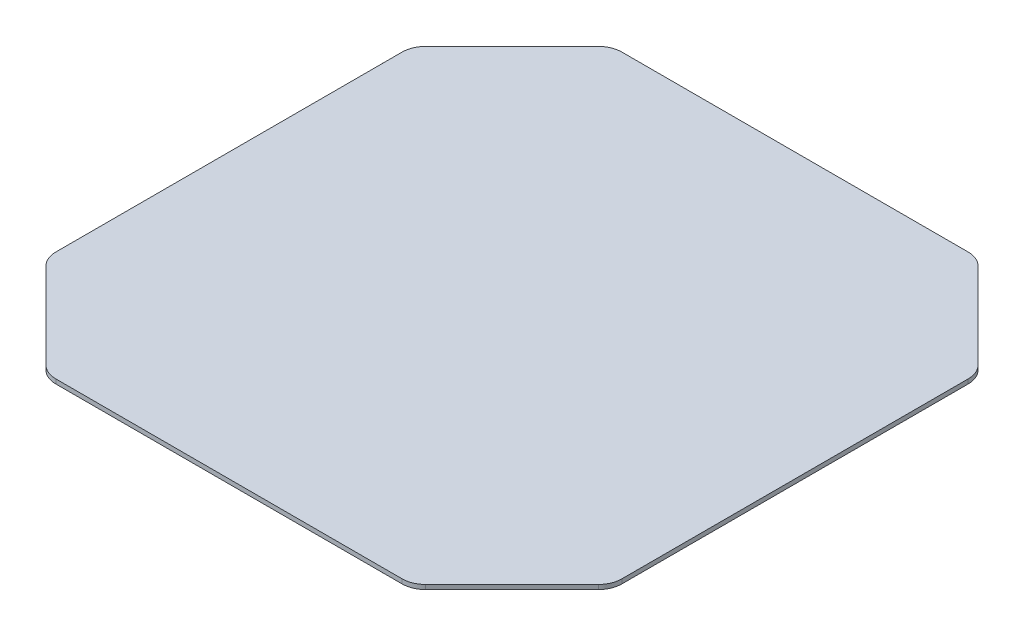
ISO-10303-21;
HEADER;
FILE_DESCRIPTION(('STEP AP214'),'2;1');
FILE_NAME('part.step','',(''),(''),'','','');
FILE_SCHEMA(('AUTOMOTIVE_DESIGN { 1 0 10303 214 1 1 1 1 }'));
ENDSEC;
DATA;
#1=APPLICATION_CONTEXT('core data for automotive mechanical design processes');
#2=APPLICATION_PROTOCOL_DEFINITION('international standard','automotive_design',2000,#1);
#3=PRODUCT_CONTEXT('',#1,'mechanical');
#4=PRODUCT('Part','Part','',(#3));
#5=PRODUCT_RELATED_PRODUCT_CATEGORY('part','',(#4));
#6=PRODUCT_DEFINITION_FORMATION('','',#4);
#7=PRODUCT_DEFINITION_CONTEXT('part definition',#1,'design');
#8=PRODUCT_DEFINITION('design','',#6,#7);
#9=PRODUCT_DEFINITION_SHAPE('','',#8);
#10=(LENGTH_UNIT() NAMED_UNIT(*) SI_UNIT(.MILLI.,.METRE.));
#11=(NAMED_UNIT(*) PLANE_ANGLE_UNIT() SI_UNIT($,.RADIAN.));
#12=(NAMED_UNIT(*) SI_UNIT($,.STERADIAN.) SOLID_ANGLE_UNIT());
#13=UNCERTAINTY_MEASURE_WITH_UNIT(LENGTH_MEASURE(1.E-05),#10,'distance_accuracy_value','');
#14=(GEOMETRIC_REPRESENTATION_CONTEXT(3) GLOBAL_UNCERTAINTY_ASSIGNED_CONTEXT((#13)) GLOBAL_UNIT_ASSIGNED_CONTEXT((#10,
#11,#12)) REPRESENTATION_CONTEXT('',''));
#15=CARTESIAN_POINT('',(0.,0.,0.));
#16=DIRECTION('',(0.,0.,1.));
#17=DIRECTION('',(1.,0.,0.));
#18=AXIS2_PLACEMENT_3D('',#15,#16,#17);
#19=CARTESIAN_POINT('',(-609.6,9.525,609.6));
#20=DIRECTION('',(0.,1.,0.));
#21=DIRECTION('',(0.,0.,1.));
#22=AXIS2_PLACEMENT_3D('',#19,#20,#21);
#23=PLANE('',#22);
#24=DIRECTION('',(-0.707106781186548,0.,-0.707106781186548));
#25=VECTOR('',#24,1.);
#26=CARTESIAN_POINT('',(501.83692654717,9.525,-501.83692654717));
#27=LINE('',#26,#25);
#28=CARTESIAN_POINT('',(594.721024484277,9.525,-408.952828610064));
#29=VERTEX_POINT('',#28);
#30=CARTESIAN_POINT('',(408.952828610064,9.525,-594.721024484277));
#31=VERTEX_POINT('',#30);
#32=EDGE_CURVE('E311',#29,#31,#27,.T.);
#33=ORIENTED_EDGE('',*,*,#32,.T.);
#34=CARTESIAN_POINT('',(373.031804125787,9.525,-558.8));
#35=DIRECTION('',(0.,1.,0.));
#36=DIRECTION('',(0.,0.,1.));
#37=AXIS2_PLACEMENT_3D('',#34,#35,#36);
#38=CIRCLE('',#37,50.8);
#39=CARTESIAN_POINT('',(373.031804125787,9.525,-609.6));
#40=VERTEX_POINT('',#39);
#41=EDGE_CURVE('E239',#31,#40,#38,.T.);
#42=ORIENTED_EDGE('',*,*,#41,.T.);
#43=DIRECTION('',(-1.,0.,0.));
#44=VECTOR('',#43,1.);
#45=CARTESIAN_POINT('',(-609.6,9.525,-609.6));
#46=LINE('',#45,#44);
#47=CARTESIAN_POINT('',(-373.031804125787,9.525,-609.6));
#48=VERTEX_POINT('',#47);
#49=EDGE_CURVE('E184',#40,#48,#46,.T.);
#50=ORIENTED_EDGE('',*,*,#49,.T.);
#51=CARTESIAN_POINT('',(-373.031804125787,9.52500000000001,-558.8));
#52=DIRECTION('',(0.,1.,0.));
#53=DIRECTION('',(0.,0.,1.));
#54=AXIS2_PLACEMENT_3D('',#51,#52,#53);
#55=CIRCLE('',#54,50.8);
#56=CARTESIAN_POINT('',(-408.952828610064,9.525,-594.721024484277));
#57=VERTEX_POINT('',#56);
#58=EDGE_CURVE('E55',#48,#57,#55,.T.);
#59=ORIENTED_EDGE('',*,*,#58,.T.);
#60=DIRECTION('',(0.707106781186548,0.,-0.707106781186548));
#61=VECTOR('',#60,1.);
#62=CARTESIAN_POINT('',(-1111.43692654717,9.525,107.76307345283));
#63=LINE('',#62,#61);
#64=CARTESIAN_POINT('',(-594.721024484277,9.525,-408.952828610064));
#65=VERTEX_POINT('',#64);
#66=EDGE_CURVE('E298',#65,#57,#63,.T.);
#67=ORIENTED_EDGE('',*,*,#66,.F.);
#68=CARTESIAN_POINT('',(-558.8,9.525,-373.031804125787));
#69=DIRECTION('',(0.,1.,0.));
#70=DIRECTION('',(0.,0.,1.));
#71=AXIS2_PLACEMENT_3D('',#68,#69,#70);
#72=CIRCLE('',#71,50.8);
#73=CARTESIAN_POINT('',(-609.6,9.525,-373.031804125787));
#74=VERTEX_POINT('',#73);
#75=EDGE_CURVE('E224',#65,#74,#72,.T.);
#76=ORIENTED_EDGE('',*,*,#75,.T.);
#77=DIRECTION('',(0.,0.,1.));
#78=VECTOR('',#77,1.);
#79=CARTESIAN_POINT('',(-609.6,9.525,-609.6));
#80=LINE('',#79,#78);
#81=CARTESIAN_POINT('',(-609.6,9.525,373.031804125787));
#82=VERTEX_POINT('',#81);
#83=EDGE_CURVE('E193',#74,#82,#80,.T.);
#84=ORIENTED_EDGE('',*,*,#83,.T.);
#85=CARTESIAN_POINT('',(-558.8,9.52500000000001,373.031804125787));
#86=DIRECTION('',(0.,1.,0.));
#87=DIRECTION('',(0.,0.,1.));
#88=AXIS2_PLACEMENT_3D('',#85,#86,#87);
#89=CIRCLE('',#88,50.8);
#90=CARTESIAN_POINT('',(-594.721024484277,9.525,408.952828610064));
#91=VERTEX_POINT('',#90);
#92=EDGE_CURVE('E227',#82,#91,#89,.T.);
#93=ORIENTED_EDGE('',*,*,#92,.T.);
#94=DIRECTION('',(0.707106781186548,0.,0.707106781186548));
#95=VECTOR('',#94,1.);
#96=CARTESIAN_POINT('',(-501.83692654717,9.525,501.83692654717));
#97=LINE('',#96,#95);
#98=CARTESIAN_POINT('',(-408.952828610064,9.525,594.721024484277));
#99=VERTEX_POINT('',#98);
#100=EDGE_CURVE('E291',#91,#99,#97,.T.);
#101=ORIENTED_EDGE('',*,*,#100,.T.);
#102=CARTESIAN_POINT('',(-373.031804125787,9.525,558.8));
#103=DIRECTION('',(0.,1.,0.));
#104=DIRECTION('',(0.,0.,1.));
#105=AXIS2_PLACEMENT_3D('',#102,#103,#104);
#106=CIRCLE('',#105,50.8);
#107=CARTESIAN_POINT('',(-373.031804125787,9.525,609.6));
#108=VERTEX_POINT('',#107);
#109=EDGE_CURVE('E229',#99,#108,#106,.T.);
#110=ORIENTED_EDGE('',*,*,#109,.T.);
#111=DIRECTION('',(1.,0.,0.));
#112=VECTOR('',#111,1.);
#113=CARTESIAN_POINT('',(-609.6,9.525,609.6));
#114=LINE('',#113,#112);
#115=CARTESIAN_POINT('',(373.031804125787,9.525,609.6));
#116=VERTEX_POINT('',#115);
#117=EDGE_CURVE('E199',#108,#116,#114,.T.);
#118=ORIENTED_EDGE('',*,*,#117,.T.);
#119=CARTESIAN_POINT('',(373.031804125787,9.52500000000001,558.8));
#120=DIRECTION('',(0.,1.,0.));
#121=DIRECTION('',(0.,0.,1.));
#122=AXIS2_PLACEMENT_3D('',#119,#120,#121);
#123=CIRCLE('',#122,50.8);
#124=CARTESIAN_POINT('',(408.952828610064,9.525,594.721024484277));
#125=VERTEX_POINT('',#124);
#126=EDGE_CURVE('E231',#116,#125,#123,.T.);
#127=ORIENTED_EDGE('',*,*,#126,.T.);
#128=DIRECTION('',(-0.707106781186548,0.,0.707106781186548));
#129=VECTOR('',#128,1.);
#130=CARTESIAN_POINT('',(-107.76307345283,9.525,1111.43692654717));
#131=LINE('',#130,#129);
#132=CARTESIAN_POINT('',(594.721024484277,9.525,408.952828610064));
#133=VERTEX_POINT('',#132);
#134=EDGE_CURVE('E304',#133,#125,#131,.T.);
#135=ORIENTED_EDGE('',*,*,#134,.F.);
#136=CARTESIAN_POINT('',(558.8,9.525,373.031804125787));
#137=DIRECTION('',(0.,1.,0.));
#138=DIRECTION('',(0.,0.,1.));
#139=AXIS2_PLACEMENT_3D('',#136,#137,#138);
#140=CIRCLE('',#139,50.8);
#141=CARTESIAN_POINT('',(609.6,9.525,373.031804125787));
#142=VERTEX_POINT('',#141);
#143=EDGE_CURVE('E234',#133,#142,#140,.T.);
#144=ORIENTED_EDGE('',*,*,#143,.T.);
#145=DIRECTION('',(0.,0.,-1.));
#146=VECTOR('',#145,1.);
#147=CARTESIAN_POINT('',(609.6,9.525,-609.6));
#148=LINE('',#147,#146);
#149=CARTESIAN_POINT('',(609.6,9.525,-373.031804125787));
#150=VERTEX_POINT('',#149);
#151=EDGE_CURVE('E317',#142,#150,#148,.T.);
#152=ORIENTED_EDGE('',*,*,#151,.T.);
#153=CARTESIAN_POINT('',(558.8,9.52500000000001,-373.031804125787));
#154=DIRECTION('',(0.,1.,0.));
#155=DIRECTION('',(0.,0.,1.));
#156=AXIS2_PLACEMENT_3D('',#153,#154,#155);
#157=CIRCLE('',#156,50.8);
#158=EDGE_CURVE('E237',#150,#29,#157,.T.);
#159=ORIENTED_EDGE('',*,*,#158,.T.);
#160=EDGE_LOOP('',(#33,#42,#50,#59,#67,#76,#84,#93,#101,#110,#118,#127,#135,#144,#152,#159));
#161=FACE_BOUND('',#160,.T.);
#162=ADVANCED_FACE('F40',(#161),#23,.T.);
#163=CARTESIAN_POINT('',(-609.6,0.,609.6));
#164=DIRECTION('',(0.,1.,0.));
#165=DIRECTION('',(0.,0.,1.));
#166=AXIS2_PLACEMENT_3D('',#163,#164,#165);
#167=PLANE('',#166);
#168=DIRECTION('',(-1.,0.,0.));
#169=VECTOR('',#168,1.);
#170=CARTESIAN_POINT('',(-609.6,0.,-609.6));
#171=LINE('',#170,#169);
#172=CARTESIAN_POINT('',(373.031804125787,0.,-609.6));
#173=VERTEX_POINT('',#172);
#174=CARTESIAN_POINT('',(-373.031804125787,0.,-609.6));
#175=VERTEX_POINT('',#174);
#176=EDGE_CURVE('E182',#173,#175,#171,.T.);
#177=ORIENTED_EDGE('',*,*,#176,.F.);
#178=CARTESIAN_POINT('',(373.031804125787,0.,-558.8));
#179=DIRECTION('',(0.,1.,0.));
#180=DIRECTION('',(0.,0.,1.));
#181=AXIS2_PLACEMENT_3D('',#178,#179,#180);
#182=CIRCLE('',#181,50.8);
#183=CARTESIAN_POINT('',(408.952828610064,0.,-594.721024484277));
#184=VERTEX_POINT('',#183);
#185=EDGE_CURVE('E164',#173,#184,#182,.F.);
#186=ORIENTED_EDGE('',*,*,#185,.T.);
#187=DIRECTION('',(-0.707106781186548,0.,-0.707106781186548));
#188=VECTOR('',#187,1.);
#189=CARTESIAN_POINT('',(501.83692654717,0.,-501.83692654717));
#190=LINE('',#189,#188);
#191=CARTESIAN_POINT('',(594.721024484277,0.,-408.952828610064));
#192=VERTEX_POINT('',#191);
#193=EDGE_CURVE('E308',#192,#184,#190,.T.);
#194=ORIENTED_EDGE('',*,*,#193,.F.);
#195=CARTESIAN_POINT('',(558.8,0.,-373.031804125787));
#196=DIRECTION('',(0.,1.,0.));
#197=DIRECTION('',(0.,0.,1.));
#198=AXIS2_PLACEMENT_3D('',#195,#196,#197);
#199=CIRCLE('',#198,50.8);
#200=CARTESIAN_POINT('',(609.6,0.,-373.031804125787));
#201=VERTEX_POINT('',#200);
#202=EDGE_CURVE('E176',#192,#201,#199,.F.);
#203=ORIENTED_EDGE('',*,*,#202,.T.);
#204=DIRECTION('',(0.,0.,-1.));
#205=VECTOR('',#204,1.);
#206=CARTESIAN_POINT('',(609.6,0.,-609.6));
#207=LINE('',#206,#205);
#208=CARTESIAN_POINT('',(609.6,0.,373.031804125787));
#209=VERTEX_POINT('',#208);
#210=EDGE_CURVE('E194',#209,#201,#207,.T.);
#211=ORIENTED_EDGE('',*,*,#210,.F.);
#212=CARTESIAN_POINT('',(558.8,0.,373.031804125787));
#213=DIRECTION('',(0.,1.,0.));
#214=DIRECTION('',(0.,0.,1.));
#215=AXIS2_PLACEMENT_3D('',#212,#213,#214);
#216=CIRCLE('',#215,50.8);
#217=CARTESIAN_POINT('',(594.721024484277,0.,408.952828610064));
#218=VERTEX_POINT('',#217);
#219=EDGE_CURVE('E217',#209,#218,#216,.F.);
#220=ORIENTED_EDGE('',*,*,#219,.T.);
#221=DIRECTION('',(-0.707106781186548,0.,0.707106781186548));
#222=VECTOR('',#221,1.);
#223=CARTESIAN_POINT('',(-107.76307345283,0.,1111.43692654717));
#224=LINE('',#223,#222);
#225=CARTESIAN_POINT('',(408.952828610064,0.,594.721024484277));
#226=VERTEX_POINT('',#225);
#227=EDGE_CURVE('E300',#218,#226,#224,.T.);
#228=ORIENTED_EDGE('',*,*,#227,.T.);
#229=CARTESIAN_POINT('',(373.031804125787,0.,558.8));
#230=DIRECTION('',(0.,1.,0.));
#231=DIRECTION('',(0.,0.,1.));
#232=AXIS2_PLACEMENT_3D('',#229,#230,#231);
#233=CIRCLE('',#232,50.8);
#234=CARTESIAN_POINT('',(373.031804125787,0.,609.6));
#235=VERTEX_POINT('',#234);
#236=EDGE_CURVE('E214',#226,#235,#233,.F.);
#237=ORIENTED_EDGE('',*,*,#236,.T.);
#238=DIRECTION('',(1.,0.,0.));
#239=VECTOR('',#238,1.);
#240=CARTESIAN_POINT('',(-609.6,0.,609.6));
#241=LINE('',#240,#239);
#242=CARTESIAN_POINT('',(-373.031804125787,0.,609.6));
#243=VERTEX_POINT('',#242);
#244=EDGE_CURVE('E203',#243,#235,#241,.T.);
#245=ORIENTED_EDGE('',*,*,#244,.F.);
#246=CARTESIAN_POINT('',(-373.031804125787,0.,558.8));
#247=DIRECTION('',(0.,1.,0.));
#248=DIRECTION('',(0.,0.,1.));
#249=AXIS2_PLACEMENT_3D('',#246,#247,#248);
#250=CIRCLE('',#249,50.8);
#251=CARTESIAN_POINT('',(-408.952828610064,0.,594.721024484277));
#252=VERTEX_POINT('',#251);
#253=EDGE_CURVE('E212',#243,#252,#250,.F.);
#254=ORIENTED_EDGE('',*,*,#253,.T.);
#255=DIRECTION('',(0.707106781186548,0.,0.707106781186548));
#256=VECTOR('',#255,1.);
#257=CARTESIAN_POINT('',(-501.83692654717,0.,501.83692654717));
#258=LINE('',#257,#256);
#259=CARTESIAN_POINT('',(-594.721024484277,0.,408.952828610064));
#260=VERTEX_POINT('',#259);
#261=EDGE_CURVE('E289',#260,#252,#258,.T.);
#262=ORIENTED_EDGE('',*,*,#261,.F.);
#263=CARTESIAN_POINT('',(-558.8,0.,373.031804125787));
#264=DIRECTION('',(0.,1.,0.));
#265=DIRECTION('',(0.,0.,1.));
#266=AXIS2_PLACEMENT_3D('',#263,#264,#265);
#267=CIRCLE('',#266,50.8);
#268=CARTESIAN_POINT('',(-609.6,0.,373.031804125787));
#269=VERTEX_POINT('',#268);
#270=EDGE_CURVE('E210',#260,#269,#267,.F.);
#271=ORIENTED_EDGE('',*,*,#270,.T.);
#272=DIRECTION('',(0.,0.,1.));
#273=VECTOR('',#272,1.);
#274=CARTESIAN_POINT('',(-609.6,0.,-609.6));
#275=LINE('',#274,#273);
#276=CARTESIAN_POINT('',(-609.6,0.,-373.031804125787));
#277=VERTEX_POINT('',#276);
#278=EDGE_CURVE('E276',#277,#269,#275,.T.);
#279=ORIENTED_EDGE('',*,*,#278,.F.);
#280=CARTESIAN_POINT('',(-558.8,0.,-373.031804125787));
#281=DIRECTION('',(0.,1.,0.));
#282=DIRECTION('',(0.,0.,1.));
#283=AXIS2_PLACEMENT_3D('',#280,#281,#282);
#284=CIRCLE('',#283,50.8);
#285=CARTESIAN_POINT('',(-594.721024484277,0.,-408.952828610064));
#286=VERTEX_POINT('',#285);
#287=EDGE_CURVE('E186',#277,#286,#284,.F.);
#288=ORIENTED_EDGE('',*,*,#287,.T.);
#289=DIRECTION('',(0.707106781186548,0.,-0.707106781186548));
#290=VECTOR('',#289,1.);
#291=CARTESIAN_POINT('',(-1111.43692654717,0.,107.76307345283));
#292=LINE('',#291,#290);
#293=CARTESIAN_POINT('',(-408.952828610064,0.,-594.721024484277));
#294=VERTEX_POINT('',#293);
#295=EDGE_CURVE('E294',#286,#294,#292,.T.);
#296=ORIENTED_EDGE('',*,*,#295,.T.);
#297=CARTESIAN_POINT('',(-373.031804125787,0.,-558.8));
#298=DIRECTION('',(0.,1.,0.));
#299=DIRECTION('',(0.,0.,1.));
#300=AXIS2_PLACEMENT_3D('',#297,#298,#299);
#301=CIRCLE('',#300,50.8);
#302=EDGE_CURVE('E191',#294,#175,#301,.F.);
#303=ORIENTED_EDGE('',*,*,#302,.T.);
#304=EDGE_LOOP('',(#177,#186,#194,#203,#211,#220,#228,#237,#245,#254,#262,#271,#279,#288,#296,#303));
#305=FACE_BOUND('',#304,.T.);
#306=ADVANCED_FACE('F189',(#305),#167,.F.);
#307=CARTESIAN_POINT('',(-609.6,9.525,-609.6));
#308=DIRECTION('',(1.,0.,0.));
#309=DIRECTION('',(0.,0.,-1.));
#310=AXIS2_PLACEMENT_3D('',#307,#308,#309);
#311=PLANE('',#310);
#312=ORIENTED_EDGE('',*,*,#278,.T.);
#313=DIRECTION('',(0.,-1.,0.));
#314=VECTOR('',#313,1.);
#315=CARTESIAN_POINT('',(-609.6,9.52500000000001,373.031804125787));
#316=LINE('',#315,#314);
#317=EDGE_CURVE('E268',#269,#82,#316,.F.);
#318=ORIENTED_EDGE('',*,*,#317,.T.);
#319=ORIENTED_EDGE('',*,*,#83,.F.);
#320=DIRECTION('',(0.,-1.,0.));
#321=VECTOR('',#320,1.);
#322=CARTESIAN_POINT('',(-609.6,9.525,-373.031804125787));
#323=LINE('',#322,#321);
#324=EDGE_CURVE('E265',#74,#277,#323,.T.);
#325=ORIENTED_EDGE('',*,*,#324,.T.);
#326=EDGE_LOOP('',(#312,#318,#319,#325));
#327=FACE_BOUND('',#326,.T.);
#328=ADVANCED_FACE('F273',(#327),#311,.F.);
#329=CARTESIAN_POINT('',(-609.6,9.525,609.6));
#330=DIRECTION('',(0.,0.,-1.));
#331=DIRECTION('',(-1.,0.,0.));
#332=AXIS2_PLACEMENT_3D('',#329,#330,#331);
#333=PLANE('',#332);
#334=ORIENTED_EDGE('',*,*,#244,.T.);
#335=DIRECTION('',(0.,-1.,0.));
#336=VECTOR('',#335,1.);
#337=CARTESIAN_POINT('',(373.031804125787,9.525,609.6));
#338=LINE('',#337,#336);
#339=EDGE_CURVE('E257',#235,#116,#338,.F.);
#340=ORIENTED_EDGE('',*,*,#339,.T.);
#341=ORIENTED_EDGE('',*,*,#117,.F.);
#342=DIRECTION('',(0.,-1.,0.));
#343=VECTOR('',#342,1.);
#344=CARTESIAN_POINT('',(-373.031804125787,0.,609.6));
#345=LINE('',#344,#343);
#346=EDGE_CURVE('E254',#108,#243,#345,.T.);
#347=ORIENTED_EDGE('',*,*,#346,.T.);
#348=EDGE_LOOP('',(#334,#340,#341,#347));
#349=FACE_BOUND('',#348,.T.);
#350=ADVANCED_FACE('F326',(#349),#333,.F.);
#351=CARTESIAN_POINT('',(394.07385309434,2176.72560548583,-609.6));
#352=DIRECTION('',(0.707106781186548,0.,-0.707106781186548));
#353=DIRECTION('',(-0.707106781186548,0.,-0.707106781186548));
#354=AXIS2_PLACEMENT_3D('',#351,#352,#353);
#355=PLANE('',#354);
#356=ORIENTED_EDGE('',*,*,#193,.T.);
#357=DIRECTION('',(0.,-1.,0.));
#358=VECTOR('',#357,1.);
#359=CARTESIAN_POINT('',(408.952828610064,9.525,-594.721024484277));
#360=LINE('',#359,#358);
#361=EDGE_CURVE('E169',#184,#31,#360,.F.);
#362=ORIENTED_EDGE('',*,*,#361,.T.);
#363=ORIENTED_EDGE('',*,*,#32,.F.);
#364=DIRECTION('',(0.,-1.,0.));
#365=VECTOR('',#364,1.);
#366=CARTESIAN_POINT('',(594.721024484277,0.,-408.952828610064));
#367=LINE('',#366,#365);
#368=EDGE_CURVE('E175',#29,#192,#367,.T.);
#369=ORIENTED_EDGE('',*,*,#368,.T.);
#370=EDGE_LOOP('',(#356,#362,#363,#369));
#371=FACE_BOUND('',#370,.T.);
#372=ADVANCED_FACE('F353',(#371),#355,.T.);
#373=CARTESIAN_POINT('',(609.6,9.525,-609.6));
#374=DIRECTION('',(-1.,0.,0.));
#375=DIRECTION('',(0.,0.,1.));
#376=AXIS2_PLACEMENT_3D('',#373,#374,#375);
#377=PLANE('',#376);
#378=ORIENTED_EDGE('',*,*,#210,.T.);
#379=DIRECTION('',(0.,-1.,0.));
#380=VECTOR('',#379,1.);
#381=CARTESIAN_POINT('',(609.6,9.52500000000001,-373.031804125787));
#382=LINE('',#381,#380);
#383=EDGE_CURVE('E245',#201,#150,#382,.F.);
#384=ORIENTED_EDGE('',*,*,#383,.T.);
#385=ORIENTED_EDGE('',*,*,#151,.F.);
#386=DIRECTION('',(0.,-1.,0.));
#387=VECTOR('',#386,1.);
#388=CARTESIAN_POINT('',(609.6,9.525,373.031804125787));
#389=LINE('',#388,#387);
#390=EDGE_CURVE('E242',#142,#209,#389,.T.);
#391=ORIENTED_EDGE('',*,*,#390,.T.);
#392=EDGE_LOOP('',(#378,#384,#385,#391));
#393=FACE_BOUND('',#392,.T.);
#394=ADVANCED_FACE('F345',(#393),#377,.F.);
#395=CARTESIAN_POINT('',(-609.6,9.525,-609.6));
#396=DIRECTION('',(0.,0.,1.));
#397=DIRECTION('',(1.,0.,0.));
#398=AXIS2_PLACEMENT_3D('',#395,#396,#397);
#399=PLANE('',#398);
#400=ORIENTED_EDGE('',*,*,#49,.F.);
#401=DIRECTION('',(0.,-1.,0.));
#402=VECTOR('',#401,1.);
#403=CARTESIAN_POINT('',(373.031804125787,0.,-609.6));
#404=LINE('',#403,#402);
#405=EDGE_CURVE('E168',#40,#173,#404,.T.);
#406=ORIENTED_EDGE('',*,*,#405,.T.);
#407=ORIENTED_EDGE('',*,*,#176,.T.);
#408=DIRECTION('',(0.,-1.,0.));
#409=VECTOR('',#408,1.);
#410=CARTESIAN_POINT('',(-373.031804125787,9.525,-609.6));
#411=LINE('',#410,#409);
#412=EDGE_CURVE('E187',#175,#48,#411,.F.);
#413=ORIENTED_EDGE('',*,*,#412,.T.);
#414=EDGE_LOOP('',(#400,#406,#407,#413));
#415=FACE_BOUND('',#414,.T.);
#416=ADVANCED_FACE('F181',(#415),#399,.F.);
#417=CARTESIAN_POINT('',(394.07385309434,2164.81935548583,609.6));
#418=DIRECTION('',(-0.707106781186547,0.,-0.707106781186547));
#419=DIRECTION('',(-0.707106781186548,0.,0.707106781186548));
#420=AXIS2_PLACEMENT_3D('',#417,#418,#419);
#421=PLANE('',#420);
#422=ORIENTED_EDGE('',*,*,#227,.F.);
#423=DIRECTION('',(0.,-1.,0.));
#424=VECTOR('',#423,1.);
#425=CARTESIAN_POINT('',(594.721024484277,2164.81935548583,408.952828610064));
#426=LINE('',#425,#424);
#427=EDGE_CURVE('E251',#218,#133,#426,.F.);
#428=ORIENTED_EDGE('',*,*,#427,.T.);
#429=ORIENTED_EDGE('',*,*,#134,.T.);
#430=DIRECTION('',(0.,-1.,0.));
#431=VECTOR('',#430,1.);
#432=CARTESIAN_POINT('',(408.952828610064,2164.81935548583,594.721024484277));
#433=LINE('',#432,#431);
#434=EDGE_CURVE('E247',#125,#226,#433,.T.);
#435=ORIENTED_EDGE('',*,*,#434,.T.);
#436=EDGE_LOOP('',(#422,#428,#429,#435));
#437=FACE_BOUND('',#436,.T.);
#438=ADVANCED_FACE('F337',(#437),#421,.F.);
#439=CARTESIAN_POINT('',(-394.07385309434,2164.81935548583,-609.6));
#440=DIRECTION('',(0.707106781186547,0.,0.707106781186547));
#441=DIRECTION('',(0.707106781186548,0.,-0.707106781186548));
#442=AXIS2_PLACEMENT_3D('',#439,#440,#441);
#443=PLANE('',#442);
#444=ORIENTED_EDGE('',*,*,#66,.T.);
#445=DIRECTION('',(0.,-1.,0.));
#446=VECTOR('',#445,1.);
#447=CARTESIAN_POINT('',(-408.952828610064,2164.81935548583,-594.721024484277));
#448=LINE('',#447,#446);
#449=EDGE_CURVE('E11',#57,#294,#448,.T.);
#450=ORIENTED_EDGE('',*,*,#449,.T.);
#451=ORIENTED_EDGE('',*,*,#295,.F.);
#452=DIRECTION('',(0.,-1.,0.));
#453=VECTOR('',#452,1.);
#454=CARTESIAN_POINT('',(-594.721024484277,2164.81935548583,-408.952828610064));
#455=LINE('',#454,#453);
#456=EDGE_CURVE('E48',#286,#65,#455,.F.);
#457=ORIENTED_EDGE('',*,*,#456,.T.);
#458=EDGE_LOOP('',(#444,#450,#451,#457));
#459=FACE_BOUND('',#458,.T.);
#460=ADVANCED_FACE('F395',(#459),#443,.F.);
#461=CARTESIAN_POINT('',(-394.07385309434,2164.81935548583,609.6));
#462=DIRECTION('',(-0.707106781186547,0.,0.707106781186547));
#463=DIRECTION('',(0.707106781186548,0.,0.707106781186548));
#464=AXIS2_PLACEMENT_3D('',#461,#462,#463);
#465=PLANE('',#464);
#466=ORIENTED_EDGE('',*,*,#261,.T.);
#467=DIRECTION('',(0.,-1.,0.));
#468=VECTOR('',#467,1.);
#469=CARTESIAN_POINT('',(-408.952828610064,9.52500000000001,594.721024484277));
#470=LINE('',#469,#468);
#471=EDGE_CURVE('E263',#252,#99,#470,.F.);
#472=ORIENTED_EDGE('',*,*,#471,.T.);
#473=ORIENTED_EDGE('',*,*,#100,.F.);
#474=DIRECTION('',(0.,-1.,0.));
#475=VECTOR('',#474,1.);
#476=CARTESIAN_POINT('',(-594.721024484277,0.,408.952828610064));
#477=LINE('',#476,#475);
#478=EDGE_CURVE('E260',#91,#260,#477,.T.);
#479=ORIENTED_EDGE('',*,*,#478,.T.);
#480=EDGE_LOOP('',(#466,#472,#473,#479));
#481=FACE_BOUND('',#480,.T.);
#482=ADVANCED_FACE('F288',(#481),#465,.T.);
#483=CARTESIAN_POINT('',(373.031804125787,9.525,-558.8));
#484=DIRECTION('',(0.,1.,0.));
#485=DIRECTION('',(0.,0.,1.));
#486=AXIS2_PLACEMENT_3D('',#483,#484,#485);
#487=CYLINDRICAL_SURFACE('',#486,50.8);
#488=ORIENTED_EDGE('',*,*,#41,.F.);
#489=ORIENTED_EDGE('',*,*,#361,.F.);
#490=ORIENTED_EDGE('',*,*,#185,.F.);
#491=ORIENTED_EDGE('',*,*,#405,.F.);
#492=EDGE_LOOP('',(#488,#489,#490,#491));
#493=FACE_BOUND('',#492,.T.);
#494=ADVANCED_FACE('F167',(#493),#487,.T.);
#495=CARTESIAN_POINT('',(558.8,2176.72560548583,-373.031804125787));
#496=DIRECTION('',(0.,1.,0.));
#497=DIRECTION('',(0.,0.,1.));
#498=AXIS2_PLACEMENT_3D('',#495,#496,#497);
#499=CYLINDRICAL_SURFACE('',#498,50.8);
#500=ORIENTED_EDGE('',*,*,#158,.F.);
#501=ORIENTED_EDGE('',*,*,#383,.F.);
#502=ORIENTED_EDGE('',*,*,#202,.F.);
#503=ORIENTED_EDGE('',*,*,#368,.F.);
#504=EDGE_LOOP('',(#500,#501,#502,#503));
#505=FACE_BOUND('',#504,.T.);
#506=ADVANCED_FACE('F349',(#505),#499,.T.);
#507=CARTESIAN_POINT('',(558.8,9.525,373.031804125787));
#508=DIRECTION('',(0.,-1.,0.));
#509=DIRECTION('',(0.,0.,-1.));
#510=AXIS2_PLACEMENT_3D('',#507,#508,#509);
#511=CYLINDRICAL_SURFACE('',#510,50.8);
#512=ORIENTED_EDGE('',*,*,#143,.F.);
#513=ORIENTED_EDGE('',*,*,#427,.F.);
#514=ORIENTED_EDGE('',*,*,#219,.F.);
#515=ORIENTED_EDGE('',*,*,#390,.F.);
#516=EDGE_LOOP('',(#512,#513,#514,#515));
#517=FACE_BOUND('',#516,.T.);
#518=ADVANCED_FACE('F340',(#517),#511,.T.);
#519=CARTESIAN_POINT('',(373.031804125787,2164.81935548583,558.8));
#520=DIRECTION('',(0.,-1.,0.));
#521=DIRECTION('',(0.,0.,-1.));
#522=AXIS2_PLACEMENT_3D('',#519,#520,#521);
#523=CYLINDRICAL_SURFACE('',#522,50.8);
#524=ORIENTED_EDGE('',*,*,#126,.F.);
#525=ORIENTED_EDGE('',*,*,#339,.F.);
#526=ORIENTED_EDGE('',*,*,#236,.F.);
#527=ORIENTED_EDGE('',*,*,#434,.F.);
#528=EDGE_LOOP('',(#524,#525,#526,#527));
#529=FACE_BOUND('',#528,.T.);
#530=ADVANCED_FACE('F331',(#529),#523,.T.);
#531=CARTESIAN_POINT('',(-373.031804125787,9.525,558.8));
#532=DIRECTION('',(0.,1.,0.));
#533=DIRECTION('',(0.,0.,1.));
#534=AXIS2_PLACEMENT_3D('',#531,#532,#533);
#535=CYLINDRICAL_SURFACE('',#534,50.8);
#536=ORIENTED_EDGE('',*,*,#109,.F.);
#537=ORIENTED_EDGE('',*,*,#471,.F.);
#538=ORIENTED_EDGE('',*,*,#253,.F.);
#539=ORIENTED_EDGE('',*,*,#346,.F.);
#540=EDGE_LOOP('',(#536,#537,#538,#539));
#541=FACE_BOUND('',#540,.T.);
#542=ADVANCED_FACE('F382',(#541),#535,.T.);
#543=CARTESIAN_POINT('',(-558.8,2164.81935548583,373.031804125787));
#544=DIRECTION('',(0.,1.,0.));
#545=DIRECTION('',(0.,0.,1.));
#546=AXIS2_PLACEMENT_3D('',#543,#544,#545);
#547=CYLINDRICAL_SURFACE('',#546,50.8);
#548=ORIENTED_EDGE('',*,*,#92,.F.);
#549=ORIENTED_EDGE('',*,*,#317,.F.);
#550=ORIENTED_EDGE('',*,*,#270,.F.);
#551=ORIENTED_EDGE('',*,*,#478,.F.);
#552=EDGE_LOOP('',(#548,#549,#550,#551));
#553=FACE_BOUND('',#552,.T.);
#554=ADVANCED_FACE('F284',(#553),#547,.T.);
#555=CARTESIAN_POINT('',(-373.031804125787,2164.81935548583,-558.8));
#556=DIRECTION('',(0.,-1.,0.));
#557=DIRECTION('',(0.,0.,-1.));
#558=AXIS2_PLACEMENT_3D('',#555,#556,#557);
#559=CYLINDRICAL_SURFACE('',#558,50.8);
#560=ORIENTED_EDGE('',*,*,#58,.F.);
#561=ORIENTED_EDGE('',*,*,#412,.F.);
#562=ORIENTED_EDGE('',*,*,#302,.F.);
#563=ORIENTED_EDGE('',*,*,#449,.F.);
#564=EDGE_LOOP('',(#560,#561,#562,#563));
#565=FACE_BOUND('',#564,.T.);
#566=ADVANCED_FACE('F387',(#565),#559,.T.);
#567=CARTESIAN_POINT('',(-558.8,9.525,-373.031804125787));
#568=DIRECTION('',(0.,-1.,0.));
#569=DIRECTION('',(0.,0.,-1.));
#570=AXIS2_PLACEMENT_3D('',#567,#568,#569);
#571=CYLINDRICAL_SURFACE('',#570,50.8);
#572=ORIENTED_EDGE('',*,*,#75,.F.);
#573=ORIENTED_EDGE('',*,*,#456,.F.);
#574=ORIENTED_EDGE('',*,*,#287,.F.);
#575=ORIENTED_EDGE('',*,*,#324,.F.);
#576=EDGE_LOOP('',(#572,#573,#574,#575));
#577=FACE_BOUND('',#576,.T.);
#578=ADVANCED_FACE('F42',(#577),#571,.T.);
#579=CLOSED_SHELL('',(#162,#306,#328,#350,#372,#394,#416,#438,#460,#482,#494,#506,#518,#530,
#542,#554,#566,#578));
#580=MANIFOLD_SOLID_BREP('B2',#579);
#581=ADVANCED_BREP_SHAPE_REPRESENTATION('',(#18,#580),#14);
#582=SHAPE_DEFINITION_REPRESENTATION(#9,#581);
ENDSEC;
END-ISO-10303-21;
